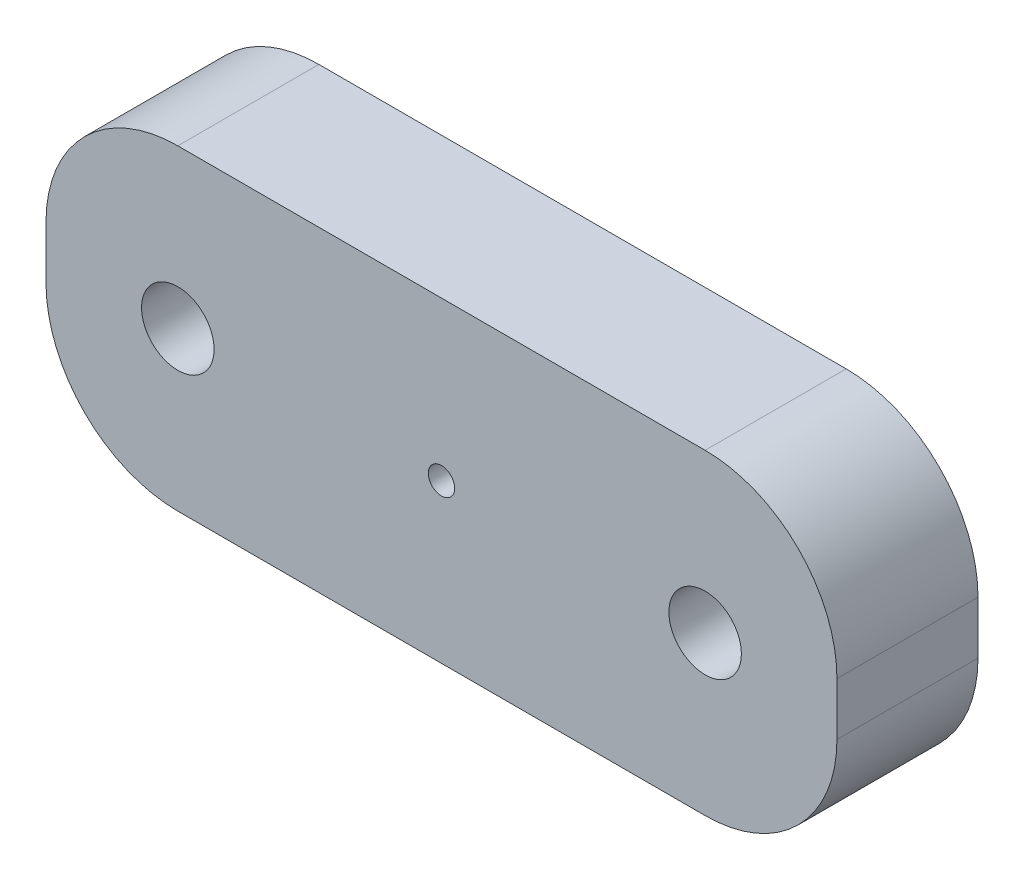
ISO-10303-21;
HEADER;
FILE_DESCRIPTION(('STEP AP214'),'2;1');
FILE_NAME('part.step','',(''),(''),'','','');
FILE_SCHEMA(('AUTOMOTIVE_DESIGN { 1 0 10303 214 1 1 1 1 }'));
ENDSEC;
DATA;
#1=APPLICATION_CONTEXT('core data for automotive mechanical design processes');
#2=APPLICATION_PROTOCOL_DEFINITION('international standard','automotive_design',2000,#1);
#3=PRODUCT_CONTEXT('',#1,'mechanical');
#4=PRODUCT('Part','Part','',(#3));
#5=PRODUCT_RELATED_PRODUCT_CATEGORY('part','',(#4));
#6=PRODUCT_DEFINITION_FORMATION('','',#4);
#7=PRODUCT_DEFINITION_CONTEXT('part definition',#1,'design');
#8=PRODUCT_DEFINITION('design','',#6,#7);
#9=PRODUCT_DEFINITION_SHAPE('','',#8);
#10=(LENGTH_UNIT() NAMED_UNIT(*) SI_UNIT(.MILLI.,.METRE.));
#11=(NAMED_UNIT(*) PLANE_ANGLE_UNIT() SI_UNIT($,.RADIAN.));
#12=(NAMED_UNIT(*) SI_UNIT($,.STERADIAN.) SOLID_ANGLE_UNIT());
#13=UNCERTAINTY_MEASURE_WITH_UNIT(LENGTH_MEASURE(1.E-05),#10,'distance_accuracy_value','');
#14=(GEOMETRIC_REPRESENTATION_CONTEXT(3) GLOBAL_UNCERTAINTY_ASSIGNED_CONTEXT((#13)) GLOBAL_UNIT_ASSIGNED_CONTEXT((#10,
#11,#12)) REPRESENTATION_CONTEXT('',''));
#15=CARTESIAN_POINT('',(0.,0.,0.));
#16=DIRECTION('',(0.,0.,1.));
#17=DIRECTION('',(1.,0.,0.));
#18=AXIS2_PLACEMENT_3D('',#15,#16,#17);
#19=CARTESIAN_POINT('',(0.,0.,5.35));
#20=DIRECTION('',(0.,1.,0.));
#21=DIRECTION('',(0.,0.,1.));
#22=AXIS2_PLACEMENT_3D('',#19,#20,#21);
#23=PLANE('',#22);
#24=DIRECTION('',(1.,0.,0.));
#25=VECTOR('',#24,1.);
#26=CARTESIAN_POINT('',(0.,0.,0.));
#27=LINE('',#26,#25);
#28=CARTESIAN_POINT('',(5.,0.,0.));
#29=VERTEX_POINT('',#28);
#30=CARTESIAN_POINT('',(24.9999994412,0.,0.));
#31=VERTEX_POINT('',#30);
#32=EDGE_CURVE('E141',#29,#31,#27,.T.);
#33=ORIENTED_EDGE('',*,*,#32,.T.);
#34=DIRECTION('',(0.,0.,-1.));
#35=VECTOR('',#34,1.);
#36=CARTESIAN_POINT('',(24.9999994412,0.,5.35));
#37=LINE('',#36,#35);
#38=CARTESIAN_POINT('',(24.9999994412,0.,5.35));
#39=VERTEX_POINT('',#38);
#40=EDGE_CURVE('E11',#39,#31,#37,.T.);
#41=ORIENTED_EDGE('',*,*,#40,.F.);
#42=DIRECTION('',(1.,0.,0.));
#43=VECTOR('',#42,1.);
#44=CARTESIAN_POINT('',(0.,0.,5.35));
#45=LINE('',#44,#43);
#46=CARTESIAN_POINT('',(5.,0.,5.35));
#47=VERTEX_POINT('',#46);
#48=EDGE_CURVE('E187',#47,#39,#45,.T.);
#49=ORIENTED_EDGE('',*,*,#48,.F.);
#50=DIRECTION('',(0.,0.,-1.));
#51=VECTOR('',#50,1.);
#52=CARTESIAN_POINT('',(5.,0.,5.35));
#53=LINE('',#52,#51);
#54=EDGE_CURVE('E128',#47,#29,#53,.T.);
#55=ORIENTED_EDGE('',*,*,#54,.T.);
#56=EDGE_LOOP('',(#33,#41,#49,#55));
#57=FACE_BOUND('',#56,.T.);
#58=ADVANCED_FACE('F35',(#57),#23,.F.);
#59=CARTESIAN_POINT('',(24.9999993294,5.,5.35));
#60=DIRECTION('',(0.,0.,-1.));
#61=DIRECTION('',(-1.,0.,0.));
#62=AXIS2_PLACEMENT_3D('',#59,#60,#61);
#63=CYLINDRICAL_SURFACE('',#62,5.);
#64=CARTESIAN_POINT('',(24.9999993294,5.,0.));
#65=DIRECTION('',(0.,0.,1.));
#66=DIRECTION('',(1.,0.,0.));
#67=AXIS2_PLACEMENT_3D('',#64,#65,#66);
#68=CIRCLE('',#67,5.);
#69=CARTESIAN_POINT('',(29.9999993294,5.,0.));
#70=VERTEX_POINT('',#69);
#71=EDGE_CURVE('E144',#31,#70,#68,.T.);
#72=ORIENTED_EDGE('',*,*,#71,.T.);
#73=DIRECTION('',(0.,0.,-1.));
#74=VECTOR('',#73,1.);
#75=CARTESIAN_POINT('',(29.9999993294,5.,5.35));
#76=LINE('',#75,#74);
#77=CARTESIAN_POINT('',(29.9999993294,5.,5.35));
#78=VERTEX_POINT('',#77);
#79=EDGE_CURVE('E44',#78,#70,#76,.T.);
#80=ORIENTED_EDGE('',*,*,#79,.F.);
#81=CARTESIAN_POINT('',(24.9999993294,5.,5.35));
#82=DIRECTION('',(0.,0.,1.));
#83=DIRECTION('',(1.,0.,0.));
#84=AXIS2_PLACEMENT_3D('',#81,#82,#83);
#85=CIRCLE('',#84,5.);
#86=EDGE_CURVE('E95',#39,#78,#85,.T.);
#87=ORIENTED_EDGE('',*,*,#86,.F.);
#88=ORIENTED_EDGE('',*,*,#40,.T.);
#89=EDGE_LOOP('',(#72,#80,#87,#88));
#90=FACE_BOUND('',#89,.T.);
#91=ADVANCED_FACE('F223',(#90),#63,.T.);
#92=CARTESIAN_POINT('',(29.9999993294,0.,5.35));
#93=DIRECTION('',(-1.,0.,0.));
#94=DIRECTION('',(0.,0.,1.));
#95=AXIS2_PLACEMENT_3D('',#92,#93,#94);
#96=PLANE('',#95);
#97=DIRECTION('',(0.,1.,0.));
#98=VECTOR('',#97,1.);
#99=CARTESIAN_POINT('',(29.9999993294,0.,0.));
#100=LINE('',#99,#98);
#101=CARTESIAN_POINT('',(29.9999993294,7.00000009970001,0.));
#102=VERTEX_POINT('',#101);
#103=EDGE_CURVE('E146',#70,#102,#100,.T.);
#104=ORIENTED_EDGE('',*,*,#103,.T.);
#105=DIRECTION('',(0.,0.,-1.));
#106=VECTOR('',#105,1.);
#107=CARTESIAN_POINT('',(29.9999993294,7.00000009970001,5.35));
#108=LINE('',#107,#106);
#109=CARTESIAN_POINT('',(29.9999993294,7.00000009970001,5.35));
#110=VERTEX_POINT('',#109);
#111=EDGE_CURVE('E162',#110,#102,#108,.T.);
#112=ORIENTED_EDGE('',*,*,#111,.F.);
#113=DIRECTION('',(0.,1.,0.));
#114=VECTOR('',#113,1.);
#115=CARTESIAN_POINT('',(29.9999993294,0.,5.35));
#116=LINE('',#115,#114);
#117=EDGE_CURVE('E170',#78,#110,#116,.T.);
#118=ORIENTED_EDGE('',*,*,#117,.F.);
#119=ORIENTED_EDGE('',*,*,#79,.T.);
#120=EDGE_LOOP('',(#104,#112,#118,#119));
#121=FACE_BOUND('',#120,.T.);
#122=ADVANCED_FACE('F168',(#121),#96,.F.);
#123=CARTESIAN_POINT('',(24.9999993294,7.0000001043,5.35));
#124=DIRECTION('',(0.,0.,-1.));
#125=DIRECTION('',(-1.,0.,0.));
#126=AXIS2_PLACEMENT_3D('',#123,#124,#125);
#127=CYLINDRICAL_SURFACE('',#126,5.);
#128=CARTESIAN_POINT('',(24.9999993294,7.0000001043,0.));
#129=DIRECTION('',(0.,0.,1.));
#130=DIRECTION('',(1.,0.,0.));
#131=AXIS2_PLACEMENT_3D('',#128,#129,#130);
#132=CIRCLE('',#131,5.);
#133=CARTESIAN_POINT('',(24.9999993294,12.0000001043,0.));
#134=VERTEX_POINT('',#133);
#135=EDGE_CURVE('E148',#102,#134,#132,.T.);
#136=ORIENTED_EDGE('',*,*,#135,.T.);
#137=DIRECTION('',(0.,0.,-1.));
#138=VECTOR('',#137,1.);
#139=CARTESIAN_POINT('',(24.9999993294,12.0000001043,5.35));
#140=LINE('',#139,#138);
#141=CARTESIAN_POINT('',(24.9999993294,12.0000001043,5.35));
#142=VERTEX_POINT('',#141);
#143=EDGE_CURVE('E159',#142,#134,#140,.T.);
#144=ORIENTED_EDGE('',*,*,#143,.F.);
#145=CARTESIAN_POINT('',(24.9999993294,7.0000001043,5.35));
#146=DIRECTION('',(0.,0.,1.));
#147=DIRECTION('',(1.,0.,0.));
#148=AXIS2_PLACEMENT_3D('',#145,#146,#147);
#149=CIRCLE('',#148,5.);
#150=EDGE_CURVE('E182',#110,#142,#149,.T.);
#151=ORIENTED_EDGE('',*,*,#150,.F.);
#152=ORIENTED_EDGE('',*,*,#111,.T.);
#153=EDGE_LOOP('',(#136,#144,#151,#152));
#154=FACE_BOUND('',#153,.T.);
#155=ADVANCED_FACE('F178',(#154),#127,.T.);
#156=CARTESIAN_POINT('',(0.,12.0000001043,5.35));
#157=DIRECTION('',(0.,-1.,0.));
#158=DIRECTION('',(0.,0.,-1.));
#159=AXIS2_PLACEMENT_3D('',#156,#157,#158);
#160=PLANE('',#159);
#161=DIRECTION('',(-1.,0.,0.));
#162=VECTOR('',#161,1.);
#163=CARTESIAN_POINT('',(0.,12.0000001043,0.));
#164=LINE('',#163,#162);
#165=CARTESIAN_POINT('',(4.99999988819999,12.0000001043,0.));
#166=VERTEX_POINT('',#165);
#167=EDGE_CURVE('E150',#134,#166,#164,.T.);
#168=ORIENTED_EDGE('',*,*,#167,.T.);
#169=DIRECTION('',(0.,0.,-1.));
#170=VECTOR('',#169,1.);
#171=CARTESIAN_POINT('',(4.99999988819999,12.0000001043,5.35));
#172=LINE('',#171,#170);
#173=CARTESIAN_POINT('',(4.99999988819999,12.0000001043,5.35));
#174=VERTEX_POINT('',#173);
#175=EDGE_CURVE('E123',#174,#166,#172,.T.);
#176=ORIENTED_EDGE('',*,*,#175,.F.);
#177=DIRECTION('',(-1.,0.,0.));
#178=VECTOR('',#177,1.);
#179=CARTESIAN_POINT('',(0.,12.0000001043,5.35));
#180=LINE('',#179,#178);
#181=EDGE_CURVE('E114',#142,#174,#180,.T.);
#182=ORIENTED_EDGE('',*,*,#181,.F.);
#183=ORIENTED_EDGE('',*,*,#143,.T.);
#184=EDGE_LOOP('',(#168,#176,#182,#183));
#185=FACE_BOUND('',#184,.T.);
#186=ADVANCED_FACE('F181',(#185),#160,.F.);
#187=CARTESIAN_POINT('',(5.,7.0000001043,5.35));
#188=DIRECTION('',(0.,0.,-1.));
#189=DIRECTION('',(-1.,0.,0.));
#190=AXIS2_PLACEMENT_3D('',#187,#188,#189);
#191=CYLINDRICAL_SURFACE('',#190,5.00000000000001);
#192=CARTESIAN_POINT('',(5.,7.0000001043,0.));
#193=DIRECTION('',(0.,0.,1.));
#194=DIRECTION('',(1.,0.,0.));
#195=AXIS2_PLACEMENT_3D('',#192,#193,#194);
#196=CIRCLE('',#195,5.00000000000001);
#197=CARTESIAN_POINT('',(0.,7.0000001043,0.));
#198=VERTEX_POINT('',#197);
#199=EDGE_CURVE('E122',#166,#198,#196,.T.);
#200=ORIENTED_EDGE('',*,*,#199,.T.);
#201=DIRECTION('',(0.,0.,-1.));
#202=VECTOR('',#201,1.);
#203=CARTESIAN_POINT('',(0.,7.0000001043,5.35));
#204=LINE('',#203,#202);
#205=CARTESIAN_POINT('',(0.,7.0000001043,5.35));
#206=VERTEX_POINT('',#205);
#207=EDGE_CURVE('E119',#206,#198,#204,.T.);
#208=ORIENTED_EDGE('',*,*,#207,.F.);
#209=CARTESIAN_POINT('',(5.,7.0000001043,5.35));
#210=DIRECTION('',(0.,0.,1.));
#211=DIRECTION('',(1.,0.,0.));
#212=AXIS2_PLACEMENT_3D('',#209,#210,#211);
#213=CIRCLE('',#212,5.00000000000001);
#214=EDGE_CURVE('E108',#174,#206,#213,.T.);
#215=ORIENTED_EDGE('',*,*,#214,.F.);
#216=ORIENTED_EDGE('',*,*,#175,.T.);
#217=EDGE_LOOP('',(#200,#208,#215,#216));
#218=FACE_BOUND('',#217,.T.);
#219=ADVANCED_FACE('F120',(#218),#191,.T.);
#220=CARTESIAN_POINT('',(0.,0.,5.35));
#221=DIRECTION('',(1.,0.,0.));
#222=DIRECTION('',(0.,0.,-1.));
#223=AXIS2_PLACEMENT_3D('',#220,#221,#222);
#224=PLANE('',#223);
#225=DIRECTION('',(0.,-1.,0.));
#226=VECTOR('',#225,1.);
#227=CARTESIAN_POINT('',(0.,0.,0.));
#228=LINE('',#227,#226);
#229=CARTESIAN_POINT('',(0.,5.0000000047,0.));
#230=VERTEX_POINT('',#229);
#231=EDGE_CURVE('E81',#198,#230,#228,.T.);
#232=ORIENTED_EDGE('',*,*,#231,.T.);
#233=DIRECTION('',(0.,0.,-1.));
#234=VECTOR('',#233,1.);
#235=CARTESIAN_POINT('',(0.,5.0000000047,5.35));
#236=LINE('',#235,#234);
#237=CARTESIAN_POINT('',(0.,5.0000000047,5.35));
#238=VERTEX_POINT('',#237);
#239=EDGE_CURVE('E124',#238,#230,#236,.T.);
#240=ORIENTED_EDGE('',*,*,#239,.F.);
#241=DIRECTION('',(0.,-1.,0.));
#242=VECTOR('',#241,1.);
#243=CARTESIAN_POINT('',(0.,0.,5.35));
#244=LINE('',#243,#242);
#245=EDGE_CURVE('E112',#206,#238,#244,.T.);
#246=ORIENTED_EDGE('',*,*,#245,.F.);
#247=ORIENTED_EDGE('',*,*,#207,.T.);
#248=EDGE_LOOP('',(#232,#240,#246,#247));
#249=FACE_BOUND('',#248,.T.);
#250=ADVANCED_FACE('F126',(#249),#224,.F.);
#251=CARTESIAN_POINT('',(14.9999996647,6.0000000522,5.35));
#252=DIRECTION('',(0.,0.,-1.));
#253=DIRECTION('',(-1.,0.,0.));
#254=AXIS2_PLACEMENT_3D('',#251,#252,#253);
#255=CYLINDRICAL_SURFACE('',#254,0.500000000000001);
#256=CARTESIAN_POINT('',(14.9999996647,6.0000000522,5.35));
#257=DIRECTION('',(0.,0.,1.));
#258=DIRECTION('',(1.,0.,0.));
#259=AXIS2_PLACEMENT_3D('',#256,#257,#258);
#260=CIRCLE('',#259,0.500000000000001);
#261=CARTESIAN_POINT('',(15.4999996647,6.0000000522,5.35));
#262=VERTEX_POINT('',#261);
#263=EDGE_CURVE('E189',#262,#262,#260,.T.);
#264=ORIENTED_EDGE('',*,*,#263,.T.);
#265=EDGE_LOOP('',(#264));
#266=FACE_BOUND('',#265,.T.);
#267=CARTESIAN_POINT('',(14.9999996647,6.0000000522,0.));
#268=DIRECTION('',(0.,0.,1.));
#269=DIRECTION('',(1.,0.,0.));
#270=AXIS2_PLACEMENT_3D('',#267,#268,#269);
#271=CIRCLE('',#270,0.500000000000001);
#272=CARTESIAN_POINT('',(15.4999996647,6.0000000522,0.));
#273=VERTEX_POINT('',#272);
#274=EDGE_CURVE('E138',#273,#273,#271,.T.);
#275=ORIENTED_EDGE('',*,*,#274,.F.);
#276=EDGE_LOOP('',(#275));
#277=FACE_BOUND('',#276,.T.);
#278=ADVANCED_FACE('F208',(#266,#277),#255,.F.);
#279=CARTESIAN_POINT('',(24.9999996647,6.0000000522,5.35));
#280=DIRECTION('',(0.,0.,-1.));
#281=DIRECTION('',(-1.,0.,0.));
#282=AXIS2_PLACEMENT_3D('',#279,#280,#281);
#283=CYLINDRICAL_SURFACE('',#282,1.375);
#284=CARTESIAN_POINT('',(24.9999996647,6.0000000522,5.35));
#285=DIRECTION('',(0.,0.,1.));
#286=DIRECTION('',(1.,0.,0.));
#287=AXIS2_PLACEMENT_3D('',#284,#285,#286);
#288=CIRCLE('',#287,1.375);
#289=CARTESIAN_POINT('',(26.3749996647,6.0000000522,5.35));
#290=VERTEX_POINT('',#289);
#291=EDGE_CURVE('E192',#290,#290,#288,.T.);
#292=ORIENTED_EDGE('',*,*,#291,.T.);
#293=EDGE_LOOP('',(#292));
#294=FACE_BOUND('',#293,.T.);
#295=CARTESIAN_POINT('',(24.9999996647,6.0000000522,0.));
#296=DIRECTION('',(0.,0.,1.));
#297=DIRECTION('',(1.,0.,0.));
#298=AXIS2_PLACEMENT_3D('',#295,#296,#297);
#299=CIRCLE('',#298,1.375);
#300=CARTESIAN_POINT('',(26.3749996647,6.0000000522,0.));
#301=VERTEX_POINT('',#300);
#302=EDGE_CURVE('E135',#301,#301,#299,.T.);
#303=ORIENTED_EDGE('',*,*,#302,.F.);
#304=EDGE_LOOP('',(#303));
#305=FACE_BOUND('',#304,.T.);
#306=ADVANCED_FACE('F211',(#294,#305),#283,.F.);
#307=CARTESIAN_POINT('',(4.99999966469999,6.0000000522,5.35));
#308=DIRECTION('',(0.,0.,-1.));
#309=DIRECTION('',(-1.,0.,0.));
#310=AXIS2_PLACEMENT_3D('',#307,#308,#309);
#311=CYLINDRICAL_SURFACE('',#310,1.375);
#312=CARTESIAN_POINT('',(4.99999966469999,6.0000000522,5.35));
#313=DIRECTION('',(0.,0.,1.));
#314=DIRECTION('',(1.,0.,0.));
#315=AXIS2_PLACEMENT_3D('',#312,#313,#314);
#316=CIRCLE('',#315,1.375);
#317=CARTESIAN_POINT('',(6.3749996647,6.0000000522,5.35));
#318=VERTEX_POINT('',#317);
#319=EDGE_CURVE('E155',#318,#318,#316,.T.);
#320=ORIENTED_EDGE('',*,*,#319,.T.);
#321=EDGE_LOOP('',(#320));
#322=FACE_BOUND('',#321,.T.);
#323=CARTESIAN_POINT('',(4.99999966469999,6.0000000522,0.));
#324=DIRECTION('',(0.,0.,1.));
#325=DIRECTION('',(1.,0.,0.));
#326=AXIS2_PLACEMENT_3D('',#323,#324,#325);
#327=CIRCLE('',#326,1.375);
#328=CARTESIAN_POINT('',(6.3749996647,6.0000000522,0.));
#329=VERTEX_POINT('',#328);
#330=EDGE_CURVE('E132',#329,#329,#327,.T.);
#331=ORIENTED_EDGE('',*,*,#330,.F.);
#332=EDGE_LOOP('',(#331));
#333=FACE_BOUND('',#332,.T.);
#334=ADVANCED_FACE('F37',(#322,#333),#311,.F.);
#335=CARTESIAN_POINT('',(5.,5.,5.35));
#336=DIRECTION('',(0.,0.,-1.));
#337=DIRECTION('',(-1.,0.,0.));
#338=AXIS2_PLACEMENT_3D('',#335,#336,#337);
#339=CYLINDRICAL_SURFACE('',#338,5.);
#340=CARTESIAN_POINT('',(5.,5.,0.));
#341=DIRECTION('',(0.,0.,1.));
#342=DIRECTION('',(1.,0.,0.));
#343=AXIS2_PLACEMENT_3D('',#340,#341,#342);
#344=CIRCLE('',#343,5.);
#345=EDGE_CURVE('E87',#230,#29,#344,.T.);
#346=ORIENTED_EDGE('',*,*,#345,.T.);
#347=ORIENTED_EDGE('',*,*,#54,.F.);
#348=CARTESIAN_POINT('',(5.,5.,5.35));
#349=DIRECTION('',(0.,0.,1.));
#350=DIRECTION('',(1.,0.,0.));
#351=AXIS2_PLACEMENT_3D('',#348,#349,#350);
#352=CIRCLE('',#351,5.);
#353=EDGE_CURVE('E52',#238,#47,#352,.T.);
#354=ORIENTED_EDGE('',*,*,#353,.F.);
#355=ORIENTED_EDGE('',*,*,#239,.T.);
#356=EDGE_LOOP('',(#346,#347,#354,#355));
#357=FACE_BOUND('',#356,.T.);
#358=ADVANCED_FACE('F202',(#357),#339,.T.);
#359=CARTESIAN_POINT('',(0.,0.,5.35));
#360=DIRECTION('',(0.,0.,1.));
#361=DIRECTION('',(1.,0.,0.));
#362=AXIS2_PLACEMENT_3D('',#359,#360,#361);
#363=PLANE('',#362);
#364=ORIENTED_EDGE('',*,*,#319,.F.);
#365=EDGE_LOOP('',(#364));
#366=FACE_BOUND('',#365,.T.);
#367=ORIENTED_EDGE('',*,*,#291,.F.);
#368=EDGE_LOOP('',(#367));
#369=FACE_BOUND('',#368,.T.);
#370=ORIENTED_EDGE('',*,*,#263,.F.);
#371=EDGE_LOOP('',(#370));
#372=FACE_BOUND('',#371,.T.);
#373=ORIENTED_EDGE('',*,*,#48,.T.);
#374=ORIENTED_EDGE('',*,*,#86,.T.);
#375=ORIENTED_EDGE('',*,*,#117,.T.);
#376=ORIENTED_EDGE('',*,*,#150,.T.);
#377=ORIENTED_EDGE('',*,*,#181,.T.);
#378=ORIENTED_EDGE('',*,*,#214,.T.);
#379=ORIENTED_EDGE('',*,*,#245,.T.);
#380=ORIENTED_EDGE('',*,*,#353,.T.);
#381=EDGE_LOOP('',(#373,#374,#375,#376,#377,#378,#379,#380));
#382=FACE_BOUND('',#381,.T.);
#383=ADVANCED_FACE('F110',(#366,#369,#372,#382),#363,.T.);
#384=CARTESIAN_POINT('',(0.,0.,0.));
#385=DIRECTION('',(0.,0.,1.));
#386=DIRECTION('',(1.,0.,0.));
#387=AXIS2_PLACEMENT_3D('',#384,#385,#386);
#388=PLANE('',#387);
#389=ORIENTED_EDGE('',*,*,#330,.T.);
#390=EDGE_LOOP('',(#389));
#391=FACE_BOUND('',#390,.T.);
#392=ORIENTED_EDGE('',*,*,#302,.T.);
#393=EDGE_LOOP('',(#392));
#394=FACE_BOUND('',#393,.T.);
#395=ORIENTED_EDGE('',*,*,#274,.T.);
#396=EDGE_LOOP('',(#395));
#397=FACE_BOUND('',#396,.T.);
#398=ORIENTED_EDGE('',*,*,#32,.F.);
#399=ORIENTED_EDGE('',*,*,#345,.F.);
#400=ORIENTED_EDGE('',*,*,#231,.F.);
#401=ORIENTED_EDGE('',*,*,#199,.F.);
#402=ORIENTED_EDGE('',*,*,#167,.F.);
#403=ORIENTED_EDGE('',*,*,#135,.F.);
#404=ORIENTED_EDGE('',*,*,#103,.F.);
#405=ORIENTED_EDGE('',*,*,#71,.F.);
#406=EDGE_LOOP('',(#398,#399,#400,#401,#402,#403,#404,#405));
#407=FACE_BOUND('',#406,.T.);
#408=ADVANCED_FACE('F174',(#391,#394,#397,#407),#388,.F.);
#409=CLOSED_SHELL('',(#58,#91,#122,#155,#186,#219,#250,#278,#306,#334,#358,#383,#408));
#410=MANIFOLD_SOLID_BREP('B2',#409);
#411=ADVANCED_BREP_SHAPE_REPRESENTATION('',(#18,#410),#14);
#412=SHAPE_DEFINITION_REPRESENTATION(#9,#411);
ENDSEC;
END-ISO-10303-21;
